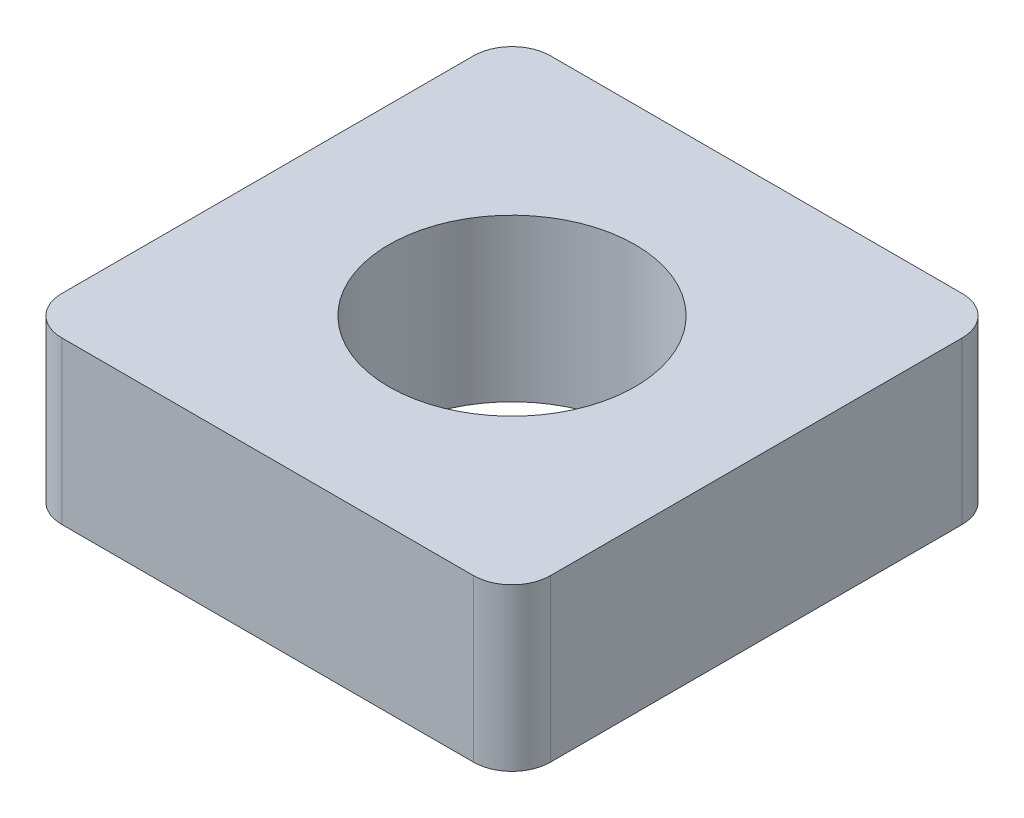
ISO-10303-21;
HEADER;
FILE_DESCRIPTION(('STEP AP214'),'2;1');
FILE_NAME('part.step','',(''),(''),'','','');
FILE_SCHEMA(('AUTOMOTIVE_DESIGN { 1 0 10303 214 1 1 1 1 }'));
ENDSEC;
DATA;
#1=APPLICATION_CONTEXT('core data for automotive mechanical design processes');
#2=APPLICATION_PROTOCOL_DEFINITION('international standard','automotive_design',2000,#1);
#3=PRODUCT_CONTEXT('',#1,'mechanical');
#4=PRODUCT('Part','Part','',(#3));
#5=PRODUCT_RELATED_PRODUCT_CATEGORY('part','',(#4));
#6=PRODUCT_DEFINITION_FORMATION('','',#4);
#7=PRODUCT_DEFINITION_CONTEXT('part definition',#1,'design');
#8=PRODUCT_DEFINITION('design','',#6,#7);
#9=PRODUCT_DEFINITION_SHAPE('','',#8);
#10=(LENGTH_UNIT() NAMED_UNIT(*) SI_UNIT(.MILLI.,.METRE.));
#11=(NAMED_UNIT(*) PLANE_ANGLE_UNIT() SI_UNIT($,.RADIAN.));
#12=(NAMED_UNIT(*) SI_UNIT($,.STERADIAN.) SOLID_ANGLE_UNIT());
#13=UNCERTAINTY_MEASURE_WITH_UNIT(LENGTH_MEASURE(1.E-05),#10,'distance_accuracy_value','');
#14=(GEOMETRIC_REPRESENTATION_CONTEXT(3) GLOBAL_UNCERTAINTY_ASSIGNED_CONTEXT((#13)) GLOBAL_UNIT_ASSIGNED_CONTEXT((#10,
#11,#12)) REPRESENTATION_CONTEXT('',''));
#15=CARTESIAN_POINT('',(0.,0.,0.));
#16=DIRECTION('',(0.,0.,1.));
#17=DIRECTION('',(1.,0.,0.));
#18=AXIS2_PLACEMENT_3D('',#15,#16,#17);
#19=CARTESIAN_POINT('',(-2.675,-1.05,-2.675));
#20=DIRECTION('',(0.,1.,0.));
#21=DIRECTION('',(0.,0.,1.));
#22=AXIS2_PLACEMENT_3D('',#19,#20,#21);
#23=CYLINDRICAL_SURFACE('',#22,0.5);
#24=DIRECTION('',(0.,1.,0.));
#25=VECTOR('',#24,1.);
#26=CARTESIAN_POINT('',(-3.175,-1.05,-2.675));
#27=LINE('',#26,#25);
#28=CARTESIAN_POINT('',(-3.175,-1.05,-2.675));
#29=VERTEX_POINT('',#28);
#30=CARTESIAN_POINT('',(-3.175,1.05,-2.675));
#31=VERTEX_POINT('',#30);
#32=EDGE_CURVE('E36',#29,#31,#27,.T.);
#33=ORIENTED_EDGE('',*,*,#32,.T.);
#34=CARTESIAN_POINT('',(-2.675,1.05,-2.675));
#35=DIRECTION('',(0.,1.,0.));
#36=DIRECTION('',(0.,0.,1.));
#37=AXIS2_PLACEMENT_3D('',#34,#35,#36);
#38=CIRCLE('',#37,0.5);
#39=CARTESIAN_POINT('',(-2.675,1.05,-3.175));
#40=VERTEX_POINT('',#39);
#41=EDGE_CURVE('E97',#40,#31,#38,.T.);
#42=ORIENTED_EDGE('',*,*,#41,.F.);
#43=DIRECTION('',(0.,1.,0.));
#44=VECTOR('',#43,1.);
#45=CARTESIAN_POINT('',(-2.675,-1.05,-3.175));
#46=LINE('',#45,#44);
#47=CARTESIAN_POINT('',(-2.675,-1.05,-3.175));
#48=VERTEX_POINT('',#47);
#49=EDGE_CURVE('E11',#48,#40,#46,.T.);
#50=ORIENTED_EDGE('',*,*,#49,.F.);
#51=CARTESIAN_POINT('',(-2.675,-1.05,-2.675));
#52=DIRECTION('',(0.,1.,0.));
#53=DIRECTION('',(0.,0.,1.));
#54=AXIS2_PLACEMENT_3D('',#51,#52,#53);
#55=CIRCLE('',#54,0.5);
#56=EDGE_CURVE('E98',#48,#29,#55,.T.);
#57=ORIENTED_EDGE('',*,*,#56,.T.);
#58=EDGE_LOOP('',(#33,#42,#50,#57));
#59=FACE_BOUND('',#58,.T.);
#60=ADVANCED_FACE('F33',(#59),#23,.T.);
#61=CARTESIAN_POINT('',(-2.675,-1.05,-3.175));
#62=DIRECTION('',(0.,0.,-1.));
#63=DIRECTION('',(-1.,0.,0.));
#64=AXIS2_PLACEMENT_3D('',#61,#62,#63);
#65=PLANE('',#64);
#66=ORIENTED_EDGE('',*,*,#49,.T.);
#67=DIRECTION('',(-1.,0.,0.));
#68=VECTOR('',#67,1.);
#69=CARTESIAN_POINT('',(-2.675,1.05,-3.175));
#70=LINE('',#69,#68);
#71=CARTESIAN_POINT('',(2.675,1.05,-3.175));
#72=VERTEX_POINT('',#71);
#73=EDGE_CURVE('E116',#72,#40,#70,.T.);
#74=ORIENTED_EDGE('',*,*,#73,.F.);
#75=DIRECTION('',(0.,1.,0.));
#76=VECTOR('',#75,1.);
#77=CARTESIAN_POINT('',(2.675,-1.05,-3.175));
#78=LINE('',#77,#76);
#79=CARTESIAN_POINT('',(2.675,-1.05,-3.175));
#80=VERTEX_POINT('',#79);
#81=EDGE_CURVE('E41',#80,#72,#78,.T.);
#82=ORIENTED_EDGE('',*,*,#81,.F.);
#83=DIRECTION('',(-1.,0.,0.));
#84=VECTOR('',#83,1.);
#85=CARTESIAN_POINT('',(-2.675,-1.05,-3.175));
#86=LINE('',#85,#84);
#87=EDGE_CURVE('E103',#80,#48,#86,.T.);
#88=ORIENTED_EDGE('',*,*,#87,.T.);
#89=EDGE_LOOP('',(#66,#74,#82,#88));
#90=FACE_BOUND('',#89,.T.);
#91=ADVANCED_FACE('F186',(#90),#65,.T.);
#92=CARTESIAN_POINT('',(2.675,-1.05,-2.675));
#93=DIRECTION('',(0.,1.,0.));
#94=DIRECTION('',(0.,0.,1.));
#95=AXIS2_PLACEMENT_3D('',#92,#93,#94);
#96=CYLINDRICAL_SURFACE('',#95,0.5);
#97=ORIENTED_EDGE('',*,*,#81,.T.);
#98=CARTESIAN_POINT('',(2.675,1.05,-2.675));
#99=DIRECTION('',(0.,1.,0.));
#100=DIRECTION('',(0.,0.,-1.));
#101=AXIS2_PLACEMENT_3D('',#98,#99,#100);
#102=CIRCLE('',#101,0.5);
#103=CARTESIAN_POINT('',(3.175,1.05,-2.675));
#104=VERTEX_POINT('',#103);
#105=EDGE_CURVE('E132',#104,#72,#102,.T.);
#106=ORIENTED_EDGE('',*,*,#105,.F.);
#107=DIRECTION('',(0.,1.,0.));
#108=VECTOR('',#107,1.);
#109=CARTESIAN_POINT('',(3.175,-1.05,-2.675));
#110=LINE('',#109,#108);
#111=CARTESIAN_POINT('',(3.175,-1.05,-2.675));
#112=VERTEX_POINT('',#111);
#113=EDGE_CURVE('E157',#112,#104,#110,.T.);
#114=ORIENTED_EDGE('',*,*,#113,.F.);
#115=CARTESIAN_POINT('',(2.675,-1.05,-2.675));
#116=DIRECTION('',(0.,1.,0.));
#117=DIRECTION('',(0.,0.,-1.));
#118=AXIS2_PLACEMENT_3D('',#115,#116,#117);
#119=CIRCLE('',#118,0.5);
#120=EDGE_CURVE('E153',#112,#80,#119,.T.);
#121=ORIENTED_EDGE('',*,*,#120,.T.);
#122=EDGE_LOOP('',(#97,#106,#114,#121));
#123=FACE_BOUND('',#122,.T.);
#124=ADVANCED_FACE('F185',(#123),#96,.T.);
#125=CARTESIAN_POINT('',(3.175,-1.05,-2.675));
#126=DIRECTION('',(1.,0.,0.));
#127=DIRECTION('',(0.,0.,-1.));
#128=AXIS2_PLACEMENT_3D('',#125,#126,#127);
#129=PLANE('',#128);
#130=ORIENTED_EDGE('',*,*,#113,.T.);
#131=DIRECTION('',(0.,0.,-1.));
#132=VECTOR('',#131,1.);
#133=CARTESIAN_POINT('',(3.175,1.05,-2.675));
#134=LINE('',#133,#132);
#135=CARTESIAN_POINT('',(3.175,1.05,2.675));
#136=VERTEX_POINT('',#135);
#137=EDGE_CURVE('E129',#136,#104,#134,.T.);
#138=ORIENTED_EDGE('',*,*,#137,.F.);
#139=DIRECTION('',(0.,1.,0.));
#140=VECTOR('',#139,1.);
#141=CARTESIAN_POINT('',(3.175,-1.05,2.675));
#142=LINE('',#141,#140);
#143=CARTESIAN_POINT('',(3.175,-1.05,2.675));
#144=VERTEX_POINT('',#143);
#145=EDGE_CURVE('E159',#144,#136,#142,.T.);
#146=ORIENTED_EDGE('',*,*,#145,.F.);
#147=DIRECTION('',(0.,0.,-1.));
#148=VECTOR('',#147,1.);
#149=CARTESIAN_POINT('',(3.175,-1.05,-2.675));
#150=LINE('',#149,#148);
#151=EDGE_CURVE('E150',#144,#112,#150,.T.);
#152=ORIENTED_EDGE('',*,*,#151,.T.);
#153=EDGE_LOOP('',(#130,#138,#146,#152));
#154=FACE_BOUND('',#153,.T.);
#155=ADVANCED_FACE('F181',(#154),#129,.T.);
#156=CARTESIAN_POINT('',(2.675,-1.05,2.675));
#157=DIRECTION('',(0.,1.,0.));
#158=DIRECTION('',(0.,0.,1.));
#159=AXIS2_PLACEMENT_3D('',#156,#157,#158);
#160=CYLINDRICAL_SURFACE('',#159,0.5);
#161=ORIENTED_EDGE('',*,*,#145,.T.);
#162=CARTESIAN_POINT('',(2.675,1.05,2.675));
#163=DIRECTION('',(0.,1.,0.));
#164=DIRECTION('',(0.,0.,1.));
#165=AXIS2_PLACEMENT_3D('',#162,#163,#164);
#166=CIRCLE('',#165,0.5);
#167=CARTESIAN_POINT('',(2.675,1.05,3.175));
#168=VERTEX_POINT('',#167);
#169=EDGE_CURVE('E126',#168,#136,#166,.T.);
#170=ORIENTED_EDGE('',*,*,#169,.F.);
#171=DIRECTION('',(0.,1.,0.));
#172=VECTOR('',#171,1.);
#173=CARTESIAN_POINT('',(2.675,-1.05,3.175));
#174=LINE('',#173,#172);
#175=CARTESIAN_POINT('',(2.675,-1.05,3.175));
#176=VERTEX_POINT('',#175);
#177=EDGE_CURVE('E161',#176,#168,#174,.T.);
#178=ORIENTED_EDGE('',*,*,#177,.F.);
#179=CARTESIAN_POINT('',(2.675,-1.05,2.675));
#180=DIRECTION('',(0.,1.,0.));
#181=DIRECTION('',(0.,0.,1.));
#182=AXIS2_PLACEMENT_3D('',#179,#180,#181);
#183=CIRCLE('',#182,0.5);
#184=EDGE_CURVE('E147',#176,#144,#183,.T.);
#185=ORIENTED_EDGE('',*,*,#184,.T.);
#186=EDGE_LOOP('',(#161,#170,#178,#185));
#187=FACE_BOUND('',#186,.T.);
#188=ADVANCED_FACE('F174',(#187),#160,.T.);
#189=CARTESIAN_POINT('',(-2.675,-1.05,3.175));
#190=DIRECTION('',(0.,0.,1.));
#191=DIRECTION('',(1.,0.,0.));
#192=AXIS2_PLACEMENT_3D('',#189,#190,#191);
#193=PLANE('',#192);
#194=ORIENTED_EDGE('',*,*,#177,.T.);
#195=DIRECTION('',(1.,0.,0.));
#196=VECTOR('',#195,1.);
#197=CARTESIAN_POINT('',(-2.675,1.05,3.175));
#198=LINE('',#197,#196);
#199=CARTESIAN_POINT('',(-2.675,1.05,3.175));
#200=VERTEX_POINT('',#199);
#201=EDGE_CURVE('E123',#200,#168,#198,.T.);
#202=ORIENTED_EDGE('',*,*,#201,.F.);
#203=DIRECTION('',(0.,1.,0.));
#204=VECTOR('',#203,1.);
#205=CARTESIAN_POINT('',(-2.675,-1.05,3.175));
#206=LINE('',#205,#204);
#207=CARTESIAN_POINT('',(-2.675,-1.05,3.175));
#208=VERTEX_POINT('',#207);
#209=EDGE_CURVE('E163',#208,#200,#206,.T.);
#210=ORIENTED_EDGE('',*,*,#209,.F.);
#211=DIRECTION('',(1.,0.,0.));
#212=VECTOR('',#211,1.);
#213=CARTESIAN_POINT('',(-2.675,-1.05,3.175));
#214=LINE('',#213,#212);
#215=EDGE_CURVE('E144',#208,#176,#214,.T.);
#216=ORIENTED_EDGE('',*,*,#215,.T.);
#217=EDGE_LOOP('',(#194,#202,#210,#216));
#218=FACE_BOUND('',#217,.T.);
#219=ADVANCED_FACE('F171',(#218),#193,.T.);
#220=CARTESIAN_POINT('',(-2.675,-1.05,2.675));
#221=DIRECTION('',(0.,1.,0.));
#222=DIRECTION('',(0.,0.,1.));
#223=AXIS2_PLACEMENT_3D('',#220,#221,#222);
#224=CYLINDRICAL_SURFACE('',#223,0.5);
#225=ORIENTED_EDGE('',*,*,#209,.T.);
#226=CARTESIAN_POINT('',(-2.675,1.05,2.675));
#227=DIRECTION('',(0.,1.,0.));
#228=DIRECTION('',(0.,0.,1.));
#229=AXIS2_PLACEMENT_3D('',#226,#227,#228);
#230=CIRCLE('',#229,0.5);
#231=CARTESIAN_POINT('',(-3.175,1.05,2.675));
#232=VERTEX_POINT('',#231);
#233=EDGE_CURVE('E110',#232,#200,#230,.T.);
#234=ORIENTED_EDGE('',*,*,#233,.F.);
#235=DIRECTION('',(0.,1.,0.));
#236=VECTOR('',#235,1.);
#237=CARTESIAN_POINT('',(-3.175,-1.05,2.675));
#238=LINE('',#237,#236);
#239=CARTESIAN_POINT('',(-3.175,-1.05,2.675));
#240=VERTEX_POINT('',#239);
#241=EDGE_CURVE('E102',#240,#232,#238,.T.);
#242=ORIENTED_EDGE('',*,*,#241,.F.);
#243=CARTESIAN_POINT('',(-2.675,-1.05,2.675));
#244=DIRECTION('',(0.,1.,0.));
#245=DIRECTION('',(0.,0.,1.));
#246=AXIS2_PLACEMENT_3D('',#243,#244,#245);
#247=CIRCLE('',#246,0.5);
#248=EDGE_CURVE('E141',#240,#208,#247,.T.);
#249=ORIENTED_EDGE('',*,*,#248,.T.);
#250=EDGE_LOOP('',(#225,#234,#242,#249));
#251=FACE_BOUND('',#250,.T.);
#252=ADVANCED_FACE('F165',(#251),#224,.T.);
#253=CARTESIAN_POINT('',(-3.175,-1.05,-2.675));
#254=DIRECTION('',(-1.,0.,0.));
#255=DIRECTION('',(0.,0.,1.));
#256=AXIS2_PLACEMENT_3D('',#253,#254,#255);
#257=PLANE('',#256);
#258=ORIENTED_EDGE('',*,*,#241,.T.);
#259=DIRECTION('',(0.,0.,1.));
#260=VECTOR('',#259,1.);
#261=CARTESIAN_POINT('',(-3.175,1.05,-2.675));
#262=LINE('',#261,#260);
#263=EDGE_CURVE('E105',#31,#232,#262,.T.);
#264=ORIENTED_EDGE('',*,*,#263,.F.);
#265=ORIENTED_EDGE('',*,*,#32,.F.);
#266=DIRECTION('',(0.,0.,1.));
#267=VECTOR('',#266,1.);
#268=CARTESIAN_POINT('',(-3.175,-1.05,-2.675));
#269=LINE('',#268,#267);
#270=EDGE_CURVE('E139',#29,#240,#269,.T.);
#271=ORIENTED_EDGE('',*,*,#270,.T.);
#272=EDGE_LOOP('',(#258,#264,#265,#271));
#273=FACE_BOUND('',#272,.T.);
#274=ADVANCED_FACE('F106',(#273),#257,.T.);
#275=CARTESIAN_POINT('',(-2.675,-1.05,-2.675));
#276=DIRECTION('',(0.,1.,0.));
#277=DIRECTION('',(0.,0.,1.));
#278=AXIS2_PLACEMENT_3D('',#275,#276,#277);
#279=PLANE('',#278);
#280=CARTESIAN_POINT('',(0.,-1.05,0.));
#281=DIRECTION('',(0.,1.,0.));
#282=DIRECTION('',(0.,0.,1.));
#283=AXIS2_PLACEMENT_3D('',#280,#281,#282);
#284=CIRCLE('',#283,1.6);
#285=CARTESIAN_POINT('',(0.,-1.05,1.6));
#286=VERTEX_POINT('',#285);
#287=EDGE_CURVE('E135',#286,#286,#284,.T.);
#288=ORIENTED_EDGE('',*,*,#287,.T.);
#289=EDGE_LOOP('',(#288));
#290=FACE_BOUND('',#289,.T.);
#291=ORIENTED_EDGE('',*,*,#56,.F.);
#292=ORIENTED_EDGE('',*,*,#87,.F.);
#293=ORIENTED_EDGE('',*,*,#120,.F.);
#294=ORIENTED_EDGE('',*,*,#151,.F.);
#295=ORIENTED_EDGE('',*,*,#184,.F.);
#296=ORIENTED_EDGE('',*,*,#215,.F.);
#297=ORIENTED_EDGE('',*,*,#248,.F.);
#298=ORIENTED_EDGE('',*,*,#270,.F.);
#299=EDGE_LOOP('',(#291,#292,#293,#294,#295,#296,#297,#298));
#300=FACE_BOUND('',#299,.T.);
#301=ADVANCED_FACE('F177',(#290,#300),#279,.F.);
#302=CARTESIAN_POINT('',(0.,-1.05,0.));
#303=DIRECTION('',(0.,1.,0.));
#304=DIRECTION('',(0.,0.,1.));
#305=AXIS2_PLACEMENT_3D('',#302,#303,#304);
#306=CYLINDRICAL_SURFACE('',#305,1.6);
#307=ORIENTED_EDGE('',*,*,#287,.F.);
#308=EDGE_LOOP('',(#307));
#309=FACE_BOUND('',#308,.T.);
#310=CARTESIAN_POINT('',(0.,1.05,0.));
#311=DIRECTION('',(0.,1.,0.));
#312=DIRECTION('',(0.,0.,1.));
#313=AXIS2_PLACEMENT_3D('',#310,#311,#312);
#314=CIRCLE('',#313,1.6);
#315=CARTESIAN_POINT('',(0.,1.05,1.6));
#316=VERTEX_POINT('',#315);
#317=EDGE_CURVE('E117',#316,#316,#314,.T.);
#318=ORIENTED_EDGE('',*,*,#317,.T.);
#319=EDGE_LOOP('',(#318));
#320=FACE_BOUND('',#319,.T.);
#321=ADVANCED_FACE('F208',(#309,#320),#306,.F.);
#322=CARTESIAN_POINT('',(-2.675,1.05,-2.675));
#323=DIRECTION('',(0.,1.,0.));
#324=DIRECTION('',(0.,0.,1.));
#325=AXIS2_PLACEMENT_3D('',#322,#323,#324);
#326=PLANE('',#325);
#327=ORIENTED_EDGE('',*,*,#41,.T.);
#328=ORIENTED_EDGE('',*,*,#263,.T.);
#329=ORIENTED_EDGE('',*,*,#233,.T.);
#330=ORIENTED_EDGE('',*,*,#201,.T.);
#331=ORIENTED_EDGE('',*,*,#169,.T.);
#332=ORIENTED_EDGE('',*,*,#137,.T.);
#333=ORIENTED_EDGE('',*,*,#105,.T.);
#334=ORIENTED_EDGE('',*,*,#73,.T.);
#335=EDGE_LOOP('',(#327,#328,#329,#330,#331,#332,#333,#334));
#336=FACE_BOUND('',#335,.T.);
#337=ORIENTED_EDGE('',*,*,#317,.F.);
#338=EDGE_LOOP('',(#337));
#339=FACE_BOUND('',#338,.T.);
#340=ADVANCED_FACE('F113',(#336,#339),#326,.T.);
#341=CLOSED_SHELL('',(#60,#91,#124,#155,#188,#219,#252,#274,#301,#321,#340));
#342=MANIFOLD_SOLID_BREP('B2',#341);
#343=ADVANCED_BREP_SHAPE_REPRESENTATION('',(#18,#342),#14);
#344=SHAPE_DEFINITION_REPRESENTATION(#9,#343);
ENDSEC;
END-ISO-10303-21;
